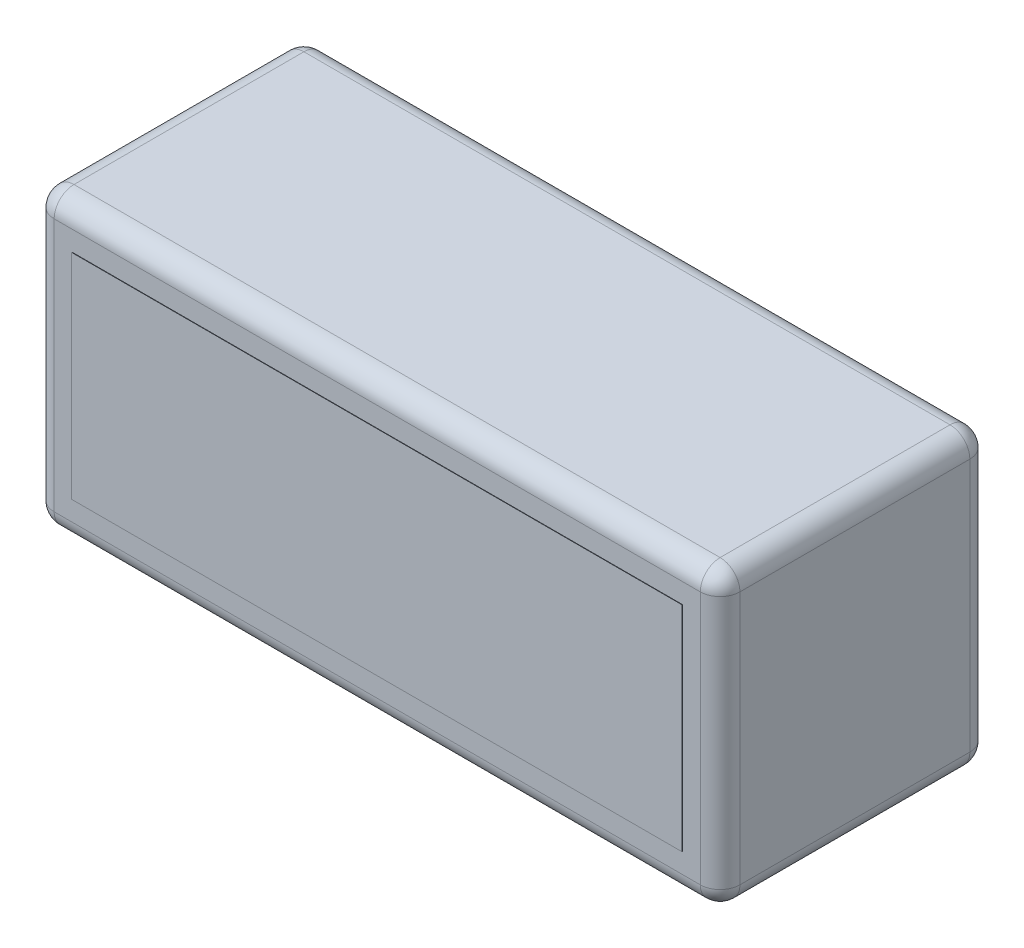
ISO-10303-21;
HEADER;
FILE_DESCRIPTION(('STEP AP214'),'2;1');
FILE_NAME('part.step','',(''),(''),'','','');
FILE_SCHEMA(('AUTOMOTIVE_DESIGN { 1 0 10303 214 1 1 1 1 }'));
ENDSEC;
DATA;
#1=APPLICATION_CONTEXT('core data for automotive mechanical design processes');
#2=APPLICATION_PROTOCOL_DEFINITION('international standard','automotive_design',2000,#1);
#3=PRODUCT_CONTEXT('',#1,'mechanical');
#4=PRODUCT('Part','Part','',(#3));
#5=PRODUCT_RELATED_PRODUCT_CATEGORY('part','',(#4));
#6=PRODUCT_DEFINITION_FORMATION('','',#4);
#7=PRODUCT_DEFINITION_CONTEXT('part definition',#1,'design');
#8=PRODUCT_DEFINITION('design','',#6,#7);
#9=PRODUCT_DEFINITION_SHAPE('','',#8);
#10=(LENGTH_UNIT() NAMED_UNIT(*) SI_UNIT(.MILLI.,.METRE.));
#11=(NAMED_UNIT(*) PLANE_ANGLE_UNIT() SI_UNIT($,.RADIAN.));
#12=(NAMED_UNIT(*) SI_UNIT($,.STERADIAN.) SOLID_ANGLE_UNIT());
#13=UNCERTAINTY_MEASURE_WITH_UNIT(LENGTH_MEASURE(1.E-05),#10,'distance_accuracy_value','');
#14=(GEOMETRIC_REPRESENTATION_CONTEXT(3) GLOBAL_UNCERTAINTY_ASSIGNED_CONTEXT((#13)) GLOBAL_UNIT_ASSIGNED_CONTEXT((#10,
#11,#12)) REPRESENTATION_CONTEXT('',''));
#15=CARTESIAN_POINT('',(0.,0.,0.));
#16=DIRECTION('',(0.,0.,1.));
#17=DIRECTION('',(1.,0.,0.));
#18=AXIS2_PLACEMENT_3D('',#15,#16,#17);
#19=CARTESIAN_POINT('',(86.5,74.,34.));
#20=DIRECTION('',(0.,0.,-1.));
#21=DIRECTION('',(-1.,0.,0.));
#22=AXIS2_PLACEMENT_3D('',#19,#20,#21);
#23=PLANE('',#22);
#24=DIRECTION('',(0.,-1.,0.));
#25=VECTOR('',#24,1.);
#26=CARTESIAN_POINT('',(-81.5,74.,34.));
#27=LINE('',#26,#25);
#28=CARTESIAN_POINT('',(-81.5,69.,34.));
#29=VERTEX_POINT('',#28);
#30=CARTESIAN_POINT('',(-81.5,5.,34.));
#31=VERTEX_POINT('',#30);
#32=EDGE_CURVE('E240',#29,#31,#27,.T.);
#33=ORIENTED_EDGE('',*,*,#32,.T.);
#34=DIRECTION('',(1.,0.,0.));
#35=VECTOR('',#34,1.);
#36=CARTESIAN_POINT('',(86.5,5.,34.));
#37=LINE('',#36,#35);
#38=CARTESIAN_POINT('',(81.5,5.,34.));
#39=VERTEX_POINT('',#38);
#40=EDGE_CURVE('E247',#31,#39,#37,.T.);
#41=ORIENTED_EDGE('',*,*,#40,.T.);
#42=DIRECTION('',(0.,-1.,0.));
#43=VECTOR('',#42,1.);
#44=CARTESIAN_POINT('',(81.5,74.,34.));
#45=LINE('',#44,#43);
#46=CARTESIAN_POINT('',(81.5,69.,34.));
#47=VERTEX_POINT('',#46);
#48=EDGE_CURVE('E243',#39,#47,#45,.F.);
#49=ORIENTED_EDGE('',*,*,#48,.T.);
#50=DIRECTION('',(1.,0.,0.));
#51=VECTOR('',#50,1.);
#52=CARTESIAN_POINT('',(-86.5,69.,34.));
#53=LINE('',#52,#51);
#54=EDGE_CURVE('E237',#47,#29,#53,.F.);
#55=ORIENTED_EDGE('',*,*,#54,.T.);
#56=EDGE_LOOP('',(#33,#41,#49,#55));
#57=FACE_BOUND('',#56,.T.);
#58=DIRECTION('',(0.,-1.,0.));
#59=VECTOR('',#58,1.);
#60=CARTESIAN_POINT('',(-76.9958074128287,10.022768222768,34.));
#61=LINE('',#60,#59);
#62=CARTESIAN_POINT('',(-76.9958074128287,63.977231777232,34.));
#63=VERTEX_POINT('',#62);
#64=CARTESIAN_POINT('',(-76.9958074128287,10.022768222768,34.));
#65=VERTEX_POINT('',#64);
#66=EDGE_CURVE('E210',#63,#65,#61,.T.);
#67=ORIENTED_EDGE('',*,*,#66,.F.);
#68=DIRECTION('',(-1.,0.,0.));
#69=VECTOR('',#68,1.);
#70=CARTESIAN_POINT('',(76.9958074128287,63.977231777232,34.));
#71=LINE('',#70,#69);
#72=CARTESIAN_POINT('',(76.9958074128287,63.977231777232,34.));
#73=VERTEX_POINT('',#72);
#74=EDGE_CURVE('E207',#73,#63,#71,.T.);
#75=ORIENTED_EDGE('',*,*,#74,.F.);
#76=DIRECTION('',(0.,1.,0.));
#77=VECTOR('',#76,1.);
#78=CARTESIAN_POINT('',(76.9958074128287,10.022768222768,34.));
#79=LINE('',#78,#77);
#80=CARTESIAN_POINT('',(76.9958074128287,10.022768222768,34.));
#81=VERTEX_POINT('',#80);
#82=EDGE_CURVE('E69',#81,#73,#79,.T.);
#83=ORIENTED_EDGE('',*,*,#82,.F.);
#84=DIRECTION('',(1.,0.,0.));
#85=VECTOR('',#84,1.);
#86=CARTESIAN_POINT('',(76.9958074128287,10.022768222768,34.));
#87=LINE('',#86,#85);
#88=EDGE_CURVE('E61',#65,#81,#87,.T.);
#89=ORIENTED_EDGE('',*,*,#88,.F.);
#90=EDGE_LOOP('',(#67,#75,#83,#89));
#91=FACE_BOUND('',#90,.T.);
#92=ADVANCED_FACE('F40',(#57,#91),#23,.F.);
#93=CARTESIAN_POINT('',(-86.5,74.,34.));
#94=DIRECTION('',(1.,0.,0.));
#95=DIRECTION('',(0.,0.,-1.));
#96=AXIS2_PLACEMENT_3D('',#93,#94,#95);
#97=PLANE('',#96);
#98=DIRECTION('',(0.,0.,1.));
#99=VECTOR('',#98,1.);
#100=CARTESIAN_POINT('',(-86.5,69.,-34.));
#101=LINE('',#100,#99);
#102=CARTESIAN_POINT('',(-86.5,69.,29.));
#103=VERTEX_POINT('',#102);
#104=CARTESIAN_POINT('',(-86.5,69.,-29.));
#105=VERTEX_POINT('',#104);
#106=EDGE_CURVE('E289',#103,#105,#101,.F.);
#107=ORIENTED_EDGE('',*,*,#106,.T.);
#108=DIRECTION('',(0.,-1.,0.));
#109=VECTOR('',#108,1.);
#110=CARTESIAN_POINT('',(-86.5,74.,-29.));
#111=LINE('',#110,#109);
#112=CARTESIAN_POINT('',(-86.5,5.,-29.));
#113=VERTEX_POINT('',#112);
#114=EDGE_CURVE('E11',#105,#113,#111,.T.);
#115=ORIENTED_EDGE('',*,*,#114,.T.);
#116=DIRECTION('',(0.,0.,1.));
#117=VECTOR('',#116,1.);
#118=CARTESIAN_POINT('',(-86.5,5.,34.));
#119=LINE('',#118,#117);
#120=CARTESIAN_POINT('',(-86.5,5.,29.));
#121=VERTEX_POINT('',#120);
#122=EDGE_CURVE('E50',#113,#121,#119,.T.);
#123=ORIENTED_EDGE('',*,*,#122,.T.);
#124=DIRECTION('',(0.,-1.,0.));
#125=VECTOR('',#124,1.);
#126=CARTESIAN_POINT('',(-86.5,74.,29.));
#127=LINE('',#126,#125);
#128=EDGE_CURVE('E292',#121,#103,#127,.F.);
#129=ORIENTED_EDGE('',*,*,#128,.T.);
#130=EDGE_LOOP('',(#107,#115,#123,#129));
#131=FACE_BOUND('',#130,.T.);
#132=ADVANCED_FACE('F423',(#131),#97,.F.);
#133=CARTESIAN_POINT('',(86.5,74.,34.));
#134=DIRECTION('',(-1.,0.,0.));
#135=DIRECTION('',(0.,0.,1.));
#136=AXIS2_PLACEMENT_3D('',#133,#134,#135);
#137=PLANE('',#136);
#138=DIRECTION('',(0.,0.,-1.));
#139=VECTOR('',#138,1.);
#140=CARTESIAN_POINT('',(86.5,69.,34.));
#141=LINE('',#140,#139);
#142=CARTESIAN_POINT('',(86.5,69.,-29.));
#143=VERTEX_POINT('',#142);
#144=CARTESIAN_POINT('',(86.5,69.,29.));
#145=VERTEX_POINT('',#144);
#146=EDGE_CURVE('E230',#143,#145,#141,.F.);
#147=ORIENTED_EDGE('',*,*,#146,.T.);
#148=DIRECTION('',(0.,-1.,0.));
#149=VECTOR('',#148,1.);
#150=CARTESIAN_POINT('',(86.5,74.,29.));
#151=LINE('',#150,#149);
#152=CARTESIAN_POINT('',(86.5,5.,29.));
#153=VERTEX_POINT('',#152);
#154=EDGE_CURVE('E233',#145,#153,#151,.T.);
#155=ORIENTED_EDGE('',*,*,#154,.T.);
#156=DIRECTION('',(0.,0.,-1.));
#157=VECTOR('',#156,1.);
#158=CARTESIAN_POINT('',(86.5,5.,34.));
#159=LINE('',#158,#157);
#160=CARTESIAN_POINT('',(86.5,5.,-29.));
#161=VERTEX_POINT('',#160);
#162=EDGE_CURVE('E224',#153,#161,#159,.T.);
#163=ORIENTED_EDGE('',*,*,#162,.T.);
#164=DIRECTION('',(0.,-1.,0.));
#165=VECTOR('',#164,1.);
#166=CARTESIAN_POINT('',(86.5,74.,-29.));
#167=LINE('',#166,#165);
#168=EDGE_CURVE('E227',#161,#143,#167,.F.);
#169=ORIENTED_EDGE('',*,*,#168,.T.);
#170=EDGE_LOOP('',(#147,#155,#163,#169));
#171=FACE_BOUND('',#170,.T.);
#172=ADVANCED_FACE('F473',(#171),#137,.F.);
#173=CARTESIAN_POINT('',(86.5,74.,-34.));
#174=DIRECTION('',(0.,0.,1.));
#175=DIRECTION('',(1.,0.,0.));
#176=AXIS2_PLACEMENT_3D('',#173,#174,#175);
#177=PLANE('',#176);
#178=DIRECTION('',(-1.,0.,0.));
#179=VECTOR('',#178,1.);
#180=CARTESIAN_POINT('',(86.5,69.,-34.));
#181=LINE('',#180,#179);
#182=CARTESIAN_POINT('',(-81.5,69.,-34.));
#183=VERTEX_POINT('',#182);
#184=CARTESIAN_POINT('',(81.5,69.,-34.));
#185=VERTEX_POINT('',#184);
#186=EDGE_CURVE('E263',#183,#185,#181,.F.);
#187=ORIENTED_EDGE('',*,*,#186,.T.);
#188=DIRECTION('',(0.,-1.,0.));
#189=VECTOR('',#188,1.);
#190=CARTESIAN_POINT('',(81.5,74.,-34.));
#191=LINE('',#190,#189);
#192=CARTESIAN_POINT('',(81.5,5.,-34.));
#193=VERTEX_POINT('',#192);
#194=EDGE_CURVE('E272',#185,#193,#191,.T.);
#195=ORIENTED_EDGE('',*,*,#194,.T.);
#196=DIRECTION('',(-1.,0.,0.));
#197=VECTOR('',#196,1.);
#198=CARTESIAN_POINT('',(86.5,5.,-34.));
#199=LINE('',#198,#197);
#200=CARTESIAN_POINT('',(-81.5,5.,-34.));
#201=VERTEX_POINT('',#200);
#202=EDGE_CURVE('E269',#193,#201,#199,.T.);
#203=ORIENTED_EDGE('',*,*,#202,.T.);
#204=DIRECTION('',(0.,-1.,0.));
#205=VECTOR('',#204,1.);
#206=CARTESIAN_POINT('',(-81.5,74.,-34.));
#207=LINE('',#206,#205);
#208=EDGE_CURVE('E266',#201,#183,#207,.F.);
#209=ORIENTED_EDGE('',*,*,#208,.T.);
#210=EDGE_LOOP('',(#187,#195,#203,#209));
#211=FACE_BOUND('',#210,.T.);
#212=ADVANCED_FACE('F408',(#211),#177,.F.);
#213=CARTESIAN_POINT('',(0.,74.,0.));
#214=DIRECTION('',(0.,1.,0.));
#215=DIRECTION('',(0.,0.,1.));
#216=AXIS2_PLACEMENT_3D('',#213,#214,#215);
#217=PLANE('',#216);
#218=DIRECTION('',(1.,0.,0.));
#219=VECTOR('',#218,1.);
#220=CARTESIAN_POINT('',(86.5,74.,29.));
#221=LINE('',#220,#219);
#222=CARTESIAN_POINT('',(-81.5,74.,29.));
#223=VERTEX_POINT('',#222);
#224=CARTESIAN_POINT('',(81.5,74.,29.));
#225=VERTEX_POINT('',#224);
#226=EDGE_CURVE('E250',#223,#225,#221,.T.);
#227=ORIENTED_EDGE('',*,*,#226,.T.);
#228=DIRECTION('',(0.,0.,-1.));
#229=VECTOR('',#228,1.);
#230=CARTESIAN_POINT('',(81.5,74.,-34.));
#231=LINE('',#230,#229);
#232=CARTESIAN_POINT('',(81.5,74.,-29.));
#233=VERTEX_POINT('',#232);
#234=EDGE_CURVE('E259',#225,#233,#231,.T.);
#235=ORIENTED_EDGE('',*,*,#234,.T.);
#236=DIRECTION('',(-1.,0.,0.));
#237=VECTOR('',#236,1.);
#238=CARTESIAN_POINT('',(-86.5,74.,-29.));
#239=LINE('',#238,#237);
#240=CARTESIAN_POINT('',(-81.5,74.,-29.));
#241=VERTEX_POINT('',#240);
#242=EDGE_CURVE('E256',#233,#241,#239,.T.);
#243=ORIENTED_EDGE('',*,*,#242,.T.);
#244=DIRECTION('',(0.,0.,1.));
#245=VECTOR('',#244,1.);
#246=CARTESIAN_POINT('',(-81.5,74.,34.));
#247=LINE('',#246,#245);
#248=EDGE_CURVE('E253',#241,#223,#247,.T.);
#249=ORIENTED_EDGE('',*,*,#248,.T.);
#250=EDGE_LOOP('',(#227,#235,#243,#249));
#251=FACE_BOUND('',#250,.T.);
#252=ADVANCED_FACE('F399',(#251),#217,.T.);
#253=CARTESIAN_POINT('',(0.,0.,0.));
#254=DIRECTION('',(0.,1.,0.));
#255=DIRECTION('',(0.,0.,1.));
#256=AXIS2_PLACEMENT_3D('',#253,#254,#255);
#257=PLANE('',#256);
#258=DIRECTION('',(-1.,0.,0.));
#259=VECTOR('',#258,1.);
#260=CARTESIAN_POINT('',(0.,0.,-29.));
#261=LINE('',#260,#259);
#262=CARTESIAN_POINT('',(-81.5,0.,-29.));
#263=VERTEX_POINT('',#262);
#264=CARTESIAN_POINT('',(81.5,0.,-29.));
#265=VERTEX_POINT('',#264);
#266=EDGE_CURVE('E282',#263,#265,#261,.F.);
#267=ORIENTED_EDGE('',*,*,#266,.T.);
#268=DIRECTION('',(0.,0.,-1.));
#269=VECTOR('',#268,1.);
#270=CARTESIAN_POINT('',(81.5,0.,0.));
#271=LINE('',#270,#269);
#272=CARTESIAN_POINT('',(81.5,0.,29.));
#273=VERTEX_POINT('',#272);
#274=EDGE_CURVE('E285',#265,#273,#271,.F.);
#275=ORIENTED_EDGE('',*,*,#274,.T.);
#276=DIRECTION('',(1.,0.,0.));
#277=VECTOR('',#276,1.);
#278=CARTESIAN_POINT('',(0.,0.,29.));
#279=LINE('',#278,#277);
#280=CARTESIAN_POINT('',(-81.5,0.,29.));
#281=VERTEX_POINT('',#280);
#282=EDGE_CURVE('E276',#273,#281,#279,.F.);
#283=ORIENTED_EDGE('',*,*,#282,.T.);
#284=DIRECTION('',(0.,0.,1.));
#285=VECTOR('',#284,1.);
#286=CARTESIAN_POINT('',(-81.5,0.,0.));
#287=LINE('',#286,#285);
#288=EDGE_CURVE('E279',#281,#263,#287,.F.);
#289=ORIENTED_EDGE('',*,*,#288,.T.);
#290=EDGE_LOOP('',(#267,#275,#283,#289));
#291=FACE_BOUND('',#290,.T.);
#292=ADVANCED_FACE('F573',(#291),#257,.F.);
#293=CARTESIAN_POINT('',(-81.5,74.,-29.));
#294=DIRECTION('',(0.,-1.,0.));
#295=DIRECTION('',(0.,0.,-1.));
#296=AXIS2_PLACEMENT_3D('',#293,#294,#295);
#297=CYLINDRICAL_SURFACE('',#296,5.);
#298=CARTESIAN_POINT('',(-81.5,69.,-29.));
#299=DIRECTION('',(0.,1.,0.));
#300=DIRECTION('',(0.,0.,1.));
#301=AXIS2_PLACEMENT_3D('',#298,#299,#300);
#302=CIRCLE('',#301,5.);
#303=EDGE_CURVE('E44',#183,#105,#302,.T.);
#304=ORIENTED_EDGE('',*,*,#303,.F.);
#305=ORIENTED_EDGE('',*,*,#208,.F.);
#306=CARTESIAN_POINT('',(-81.5,5.,-29.));
#307=DIRECTION('',(0.,-1.,0.));
#308=DIRECTION('',(0.,0.,-1.));
#309=AXIS2_PLACEMENT_3D('',#306,#307,#308);
#310=CIRCLE('',#309,5.);
#311=EDGE_CURVE('E373',#113,#201,#310,.T.);
#312=ORIENTED_EDGE('',*,*,#311,.F.);
#313=ORIENTED_EDGE('',*,*,#114,.F.);
#314=EDGE_LOOP('',(#304,#305,#312,#313));
#315=FACE_BOUND('',#314,.T.);
#316=ADVANCED_FACE('F42',(#315),#297,.T.);
#317=CARTESIAN_POINT('',(-81.5,69.,-29.));
#318=DIRECTION('',(0.,0.,1.));
#319=DIRECTION('',(1.,0.,0.));
#320=AXIS2_PLACEMENT_3D('',#317,#318,#319);
#321=SPHERICAL_SURFACE('',#320,5.);
#322=CARTESIAN_POINT('',(-81.5,69.,-29.));
#323=DIRECTION('',(-1.,0.,0.));
#324=DIRECTION('',(0.,0.,1.));
#325=AXIS2_PLACEMENT_3D('',#322,#323,#324);
#326=CIRCLE('',#325,5.);
#327=EDGE_CURVE('E366',#183,#241,#326,.F.);
#328=ORIENTED_EDGE('',*,*,#327,.F.);
#329=ORIENTED_EDGE('',*,*,#303,.T.);
#330=CARTESIAN_POINT('',(-81.5,69.,-29.));
#331=DIRECTION('',(0.,0.,-1.));
#332=DIRECTION('',(0.,1.,0.));
#333=AXIS2_PLACEMENT_3D('',#330,#331,#332);
#334=CIRCLE('',#333,5.);
#335=EDGE_CURVE('E370',#241,#105,#334,.F.);
#336=ORIENTED_EDGE('',*,*,#335,.F.);
#337=EDGE_LOOP('',(#328,#329,#336));
#338=FACE_BOUND('',#337,.T.);
#339=ADVANCED_FACE('F386',(#338),#321,.T.);
#340=CARTESIAN_POINT('',(-81.5,5.,-29.));
#341=DIRECTION('',(0.,0.,1.));
#342=DIRECTION('',(1.,0.,0.));
#343=AXIS2_PLACEMENT_3D('',#340,#341,#342);
#344=SPHERICAL_SURFACE('',#343,5.);
#345=CARTESIAN_POINT('',(-81.5,5.,-29.));
#346=DIRECTION('',(0.,0.,-1.));
#347=DIRECTION('',(-1.,0.,0.));
#348=AXIS2_PLACEMENT_3D('',#345,#346,#347);
#349=CIRCLE('',#348,5.);
#350=EDGE_CURVE('E358',#113,#263,#349,.F.);
#351=ORIENTED_EDGE('',*,*,#350,.F.);
#352=ORIENTED_EDGE('',*,*,#311,.T.);
#353=CARTESIAN_POINT('',(-81.5,5.,-29.));
#354=DIRECTION('',(-1.,0.,0.));
#355=DIRECTION('',(0.,0.,1.));
#356=AXIS2_PLACEMENT_3D('',#353,#354,#355);
#357=CIRCLE('',#356,5.);
#358=EDGE_CURVE('E362',#263,#201,#357,.F.);
#359=ORIENTED_EDGE('',*,*,#358,.F.);
#360=EDGE_LOOP('',(#351,#352,#359));
#361=FACE_BOUND('',#360,.T.);
#362=ADVANCED_FACE('F697',(#361),#344,.T.);
#363=CARTESIAN_POINT('',(-81.5,69.,0.));
#364=DIRECTION('',(0.,0.,-1.));
#365=DIRECTION('',(-1.,0.,0.));
#366=AXIS2_PLACEMENT_3D('',#363,#364,#365);
#367=CYLINDRICAL_SURFACE('',#366,5.);
#368=ORIENTED_EDGE('',*,*,#335,.T.);
#369=ORIENTED_EDGE('',*,*,#106,.F.);
#370=CARTESIAN_POINT('',(-81.5,69.,29.));
#371=DIRECTION('',(0.,0.,1.));
#372=DIRECTION('',(1.,0.,0.));
#373=AXIS2_PLACEMENT_3D('',#370,#371,#372);
#374=CIRCLE('',#373,5.);
#375=EDGE_CURVE('E350',#223,#103,#374,.T.);
#376=ORIENTED_EDGE('',*,*,#375,.F.);
#377=ORIENTED_EDGE('',*,*,#248,.F.);
#378=EDGE_LOOP('',(#368,#369,#376,#377));
#379=FACE_BOUND('',#378,.T.);
#380=ADVANCED_FACE('F394',(#379),#367,.T.);
#381=CARTESIAN_POINT('',(0.,69.,-29.));
#382=DIRECTION('',(1.,0.,0.));
#383=DIRECTION('',(0.,0.,-1.));
#384=AXIS2_PLACEMENT_3D('',#381,#382,#383);
#385=CYLINDRICAL_SURFACE('',#384,5.);
#386=ORIENTED_EDGE('',*,*,#327,.T.);
#387=ORIENTED_EDGE('',*,*,#242,.F.);
#388=CARTESIAN_POINT('',(81.5,69.,-29.));
#389=DIRECTION('',(1.,0.,0.));
#390=DIRECTION('',(0.,0.,-1.));
#391=AXIS2_PLACEMENT_3D('',#388,#389,#390);
#392=CIRCLE('',#391,5.);
#393=EDGE_CURVE('E346',#185,#233,#392,.T.);
#394=ORIENTED_EDGE('',*,*,#393,.F.);
#395=ORIENTED_EDGE('',*,*,#186,.F.);
#396=EDGE_LOOP('',(#386,#387,#394,#395));
#397=FACE_BOUND('',#396,.T.);
#398=ADVANCED_FACE('F405',(#397),#385,.T.);
#399=CARTESIAN_POINT('',(81.5,74.,-29.));
#400=DIRECTION('',(0.,-1.,0.));
#401=DIRECTION('',(0.,0.,-1.));
#402=AXIS2_PLACEMENT_3D('',#399,#400,#401);
#403=CYLINDRICAL_SURFACE('',#402,5.);
#404=CARTESIAN_POINT('',(81.5,5.,-29.));
#405=DIRECTION('',(0.,-1.,0.));
#406=DIRECTION('',(0.,0.,-1.));
#407=AXIS2_PLACEMENT_3D('',#404,#405,#406);
#408=CIRCLE('',#407,5.);
#409=EDGE_CURVE('E338',#193,#161,#408,.T.);
#410=ORIENTED_EDGE('',*,*,#409,.F.);
#411=ORIENTED_EDGE('',*,*,#194,.F.);
#412=CARTESIAN_POINT('',(81.5,69.,-29.));
#413=DIRECTION('',(0.,1.,0.));
#414=DIRECTION('',(0.,0.,1.));
#415=AXIS2_PLACEMENT_3D('',#412,#413,#414);
#416=CIRCLE('',#415,5.);
#417=EDGE_CURVE('E342',#143,#185,#416,.T.);
#418=ORIENTED_EDGE('',*,*,#417,.F.);
#419=ORIENTED_EDGE('',*,*,#168,.F.);
#420=EDGE_LOOP('',(#410,#411,#418,#419));
#421=FACE_BOUND('',#420,.T.);
#422=ADVANCED_FACE('F412',(#421),#403,.T.);
#423=CARTESIAN_POINT('',(86.5,5.,-29.));
#424=DIRECTION('',(-1.,0.,0.));
#425=DIRECTION('',(0.,0.,1.));
#426=AXIS2_PLACEMENT_3D('',#423,#424,#425);
#427=CYLINDRICAL_SURFACE('',#426,5.);
#428=ORIENTED_EDGE('',*,*,#358,.T.);
#429=ORIENTED_EDGE('',*,*,#202,.F.);
#430=CARTESIAN_POINT('',(81.5,5.,-29.));
#431=DIRECTION('',(1.,0.,0.));
#432=DIRECTION('',(0.,0.,-1.));
#433=AXIS2_PLACEMENT_3D('',#430,#431,#432);
#434=CIRCLE('',#433,5.);
#435=EDGE_CURVE('E335',#265,#193,#434,.T.);
#436=ORIENTED_EDGE('',*,*,#435,.F.);
#437=ORIENTED_EDGE('',*,*,#266,.F.);
#438=EDGE_LOOP('',(#428,#429,#436,#437));
#439=FACE_BOUND('',#438,.T.);
#440=ADVANCED_FACE('F420',(#439),#427,.T.);
#441=CARTESIAN_POINT('',(-81.5,5.,34.));
#442=DIRECTION('',(0.,0.,1.));
#443=DIRECTION('',(1.,0.,0.));
#444=AXIS2_PLACEMENT_3D('',#441,#442,#443);
#445=CYLINDRICAL_SURFACE('',#444,5.);
#446=ORIENTED_EDGE('',*,*,#350,.T.);
#447=ORIENTED_EDGE('',*,*,#288,.F.);
#448=CARTESIAN_POINT('',(-81.5,5.,29.));
#449=DIRECTION('',(0.,0.,1.));
#450=DIRECTION('',(1.,0.,0.));
#451=AXIS2_PLACEMENT_3D('',#448,#449,#450);
#452=CIRCLE('',#451,5.);
#453=EDGE_CURVE('E332',#121,#281,#452,.T.);
#454=ORIENTED_EDGE('',*,*,#453,.F.);
#455=ORIENTED_EDGE('',*,*,#122,.F.);
#456=EDGE_LOOP('',(#446,#447,#454,#455));
#457=FACE_BOUND('',#456,.T.);
#458=ADVANCED_FACE('F433',(#457),#445,.T.);
#459=CARTESIAN_POINT('',(-81.5,74.,29.));
#460=DIRECTION('',(0.,-1.,0.));
#461=DIRECTION('',(0.,0.,-1.));
#462=AXIS2_PLACEMENT_3D('',#459,#460,#461);
#463=CYLINDRICAL_SURFACE('',#462,5.);
#464=CARTESIAN_POINT('',(-81.5,69.,29.));
#465=DIRECTION('',(0.,1.,0.));
#466=DIRECTION('',(0.,0.,1.));
#467=AXIS2_PLACEMENT_3D('',#464,#465,#466);
#468=CIRCLE('',#467,5.);
#469=EDGE_CURVE('E354',#103,#29,#468,.T.);
#470=ORIENTED_EDGE('',*,*,#469,.F.);
#471=ORIENTED_EDGE('',*,*,#128,.F.);
#472=CARTESIAN_POINT('',(-81.5,5.,29.));
#473=DIRECTION('',(0.,-1.,0.));
#474=DIRECTION('',(0.,0.,-1.));
#475=AXIS2_PLACEMENT_3D('',#472,#473,#474);
#476=CIRCLE('',#475,5.);
#477=EDGE_CURVE('E329',#31,#121,#476,.T.);
#478=ORIENTED_EDGE('',*,*,#477,.F.);
#479=ORIENTED_EDGE('',*,*,#32,.F.);
#480=EDGE_LOOP('',(#470,#471,#478,#479));
#481=FACE_BOUND('',#480,.T.);
#482=ADVANCED_FACE('F428',(#481),#463,.T.);
#483=CARTESIAN_POINT('',(-81.5,69.,29.));
#484=DIRECTION('',(0.,0.,1.));
#485=DIRECTION('',(1.,0.,0.));
#486=AXIS2_PLACEMENT_3D('',#483,#484,#485);
#487=SPHERICAL_SURFACE('',#486,5.);
#488=ORIENTED_EDGE('',*,*,#375,.T.);
#489=ORIENTED_EDGE('',*,*,#469,.T.);
#490=CARTESIAN_POINT('',(-81.5,69.,29.));
#491=DIRECTION('',(-1.,0.,0.));
#492=DIRECTION('',(0.,0.,1.));
#493=AXIS2_PLACEMENT_3D('',#490,#491,#492);
#494=CIRCLE('',#493,5.);
#495=EDGE_CURVE('E325',#223,#29,#494,.F.);
#496=ORIENTED_EDGE('',*,*,#495,.F.);
#497=EDGE_LOOP('',(#488,#489,#496));
#498=FACE_BOUND('',#497,.T.);
#499=ADVANCED_FACE('F445',(#498),#487,.T.);
#500=CARTESIAN_POINT('',(81.5,69.,-29.));
#501=DIRECTION('',(0.,0.,1.));
#502=DIRECTION('',(1.,0.,0.));
#503=AXIS2_PLACEMENT_3D('',#500,#501,#502);
#504=SPHERICAL_SURFACE('',#503,5.);
#505=ORIENTED_EDGE('',*,*,#417,.T.);
#506=ORIENTED_EDGE('',*,*,#393,.T.);
#507=CARTESIAN_POINT('',(81.5,69.,-29.));
#508=DIRECTION('',(0.,0.,-1.));
#509=DIRECTION('',(-1.,0.,0.));
#510=AXIS2_PLACEMENT_3D('',#507,#508,#509);
#511=CIRCLE('',#510,5.);
#512=EDGE_CURVE('E322',#143,#233,#511,.F.);
#513=ORIENTED_EDGE('',*,*,#512,.F.);
#514=EDGE_LOOP('',(#505,#506,#513));
#515=FACE_BOUND('',#514,.T.);
#516=ADVANCED_FACE('F458',(#515),#504,.T.);
#517=CARTESIAN_POINT('',(81.5,5.,-29.));
#518=DIRECTION('',(0.,0.,1.));
#519=DIRECTION('',(1.,0.,0.));
#520=AXIS2_PLACEMENT_3D('',#517,#518,#519);
#521=SPHERICAL_SURFACE('',#520,5.);
#522=ORIENTED_EDGE('',*,*,#435,.T.);
#523=ORIENTED_EDGE('',*,*,#409,.T.);
#524=CARTESIAN_POINT('',(81.5,5.,-29.));
#525=DIRECTION('',(0.,0.,-1.));
#526=DIRECTION('',(-1.,0.,0.));
#527=AXIS2_PLACEMENT_3D('',#524,#525,#526);
#528=CIRCLE('',#527,5.);
#529=EDGE_CURVE('E318',#265,#161,#528,.F.);
#530=ORIENTED_EDGE('',*,*,#529,.F.);
#531=EDGE_LOOP('',(#522,#523,#530));
#532=FACE_BOUND('',#531,.T.);
#533=ADVANCED_FACE('F460',(#532),#521,.T.);
#534=CARTESIAN_POINT('',(-81.5,5.,29.));
#535=DIRECTION('',(0.,0.,1.));
#536=DIRECTION('',(1.,0.,0.));
#537=AXIS2_PLACEMENT_3D('',#534,#535,#536);
#538=SPHERICAL_SURFACE('',#537,5.);
#539=ORIENTED_EDGE('',*,*,#477,.T.);
#540=ORIENTED_EDGE('',*,*,#453,.T.);
#541=CARTESIAN_POINT('',(-81.5,5.,29.));
#542=DIRECTION('',(-1.,0.,0.));
#543=DIRECTION('',(0.,0.,1.));
#544=AXIS2_PLACEMENT_3D('',#541,#542,#543);
#545=CIRCLE('',#544,5.);
#546=EDGE_CURVE('E314',#31,#281,#545,.F.);
#547=ORIENTED_EDGE('',*,*,#546,.F.);
#548=EDGE_LOOP('',(#539,#540,#547));
#549=FACE_BOUND('',#548,.T.);
#550=ADVANCED_FACE('F435',(#549),#538,.T.);
#551=CARTESIAN_POINT('',(0.,69.,29.));
#552=DIRECTION('',(-1.,0.,0.));
#553=DIRECTION('',(0.,0.,1.));
#554=AXIS2_PLACEMENT_3D('',#551,#552,#553);
#555=CYLINDRICAL_SURFACE('',#554,5.);
#556=ORIENTED_EDGE('',*,*,#495,.T.);
#557=ORIENTED_EDGE('',*,*,#54,.F.);
#558=CARTESIAN_POINT('',(81.5,69.,29.));
#559=DIRECTION('',(1.,0.,0.));
#560=DIRECTION('',(0.,0.,-1.));
#561=AXIS2_PLACEMENT_3D('',#558,#559,#560);
#562=CIRCLE('',#561,5.);
#563=EDGE_CURVE('E310',#225,#47,#562,.T.);
#564=ORIENTED_EDGE('',*,*,#563,.F.);
#565=ORIENTED_EDGE('',*,*,#226,.F.);
#566=EDGE_LOOP('',(#556,#557,#564,#565));
#567=FACE_BOUND('',#566,.T.);
#568=ADVANCED_FACE('F447',(#567),#555,.T.);
#569=CARTESIAN_POINT('',(81.5,69.,0.));
#570=DIRECTION('',(0.,0.,1.));
#571=DIRECTION('',(1.,0.,0.));
#572=AXIS2_PLACEMENT_3D('',#569,#570,#571);
#573=CYLINDRICAL_SURFACE('',#572,5.);
#574=ORIENTED_EDGE('',*,*,#512,.T.);
#575=ORIENTED_EDGE('',*,*,#234,.F.);
#576=CARTESIAN_POINT('',(81.5,69.,29.));
#577=DIRECTION('',(0.,0.,1.));
#578=DIRECTION('',(1.,0.,0.));
#579=AXIS2_PLACEMENT_3D('',#576,#577,#578);
#580=CIRCLE('',#579,5.);
#581=EDGE_CURVE('E306',#145,#225,#580,.T.);
#582=ORIENTED_EDGE('',*,*,#581,.F.);
#583=ORIENTED_EDGE('',*,*,#146,.F.);
#584=EDGE_LOOP('',(#574,#575,#582,#583));
#585=FACE_BOUND('',#584,.T.);
#586=ADVANCED_FACE('F456',(#585),#573,.T.);
#587=CARTESIAN_POINT('',(81.5,5.,34.));
#588=DIRECTION('',(0.,0.,-1.));
#589=DIRECTION('',(-1.,0.,0.));
#590=AXIS2_PLACEMENT_3D('',#587,#588,#589);
#591=CYLINDRICAL_SURFACE('',#590,5.);
#592=ORIENTED_EDGE('',*,*,#529,.T.);
#593=ORIENTED_EDGE('',*,*,#162,.F.);
#594=CARTESIAN_POINT('',(81.5,5.,29.));
#595=DIRECTION('',(0.,0.,1.));
#596=DIRECTION('',(1.,0.,0.));
#597=AXIS2_PLACEMENT_3D('',#594,#595,#596);
#598=CIRCLE('',#597,5.);
#599=EDGE_CURVE('E302',#273,#153,#598,.T.);
#600=ORIENTED_EDGE('',*,*,#599,.F.);
#601=ORIENTED_EDGE('',*,*,#274,.F.);
#602=EDGE_LOOP('',(#592,#593,#600,#601));
#603=FACE_BOUND('',#602,.T.);
#604=ADVANCED_FACE('F490',(#603),#591,.T.);
#605=CARTESIAN_POINT('',(86.5,5.,29.));
#606=DIRECTION('',(1.,0.,0.));
#607=DIRECTION('',(0.,0.,-1.));
#608=AXIS2_PLACEMENT_3D('',#605,#606,#607);
#609=CYLINDRICAL_SURFACE('',#608,5.);
#610=ORIENTED_EDGE('',*,*,#546,.T.);
#611=ORIENTED_EDGE('',*,*,#282,.F.);
#612=CARTESIAN_POINT('',(81.5,5.,29.));
#613=DIRECTION('',(1.,0.,0.));
#614=DIRECTION('',(0.,0.,-1.));
#615=AXIS2_PLACEMENT_3D('',#612,#613,#614);
#616=CIRCLE('',#615,5.);
#617=EDGE_CURVE('E299',#39,#273,#616,.T.);
#618=ORIENTED_EDGE('',*,*,#617,.F.);
#619=ORIENTED_EDGE('',*,*,#40,.F.);
#620=EDGE_LOOP('',(#610,#611,#618,#619));
#621=FACE_BOUND('',#620,.T.);
#622=ADVANCED_FACE('F440',(#621),#609,.T.);
#623=CARTESIAN_POINT('',(81.5,69.,29.));
#624=DIRECTION('',(0.,0.,1.));
#625=DIRECTION('',(1.,0.,0.));
#626=AXIS2_PLACEMENT_3D('',#623,#624,#625);
#627=SPHERICAL_SURFACE('',#626,5.);
#628=ORIENTED_EDGE('',*,*,#581,.T.);
#629=ORIENTED_EDGE('',*,*,#563,.T.);
#630=CARTESIAN_POINT('',(81.5,69.,29.));
#631=DIRECTION('',(0.,1.,0.));
#632=DIRECTION('',(0.,0.,1.));
#633=AXIS2_PLACEMENT_3D('',#630,#631,#632);
#634=CIRCLE('',#633,5.);
#635=EDGE_CURVE('E217',#145,#47,#634,.F.);
#636=ORIENTED_EDGE('',*,*,#635,.F.);
#637=EDGE_LOOP('',(#628,#629,#636));
#638=FACE_BOUND('',#637,.T.);
#639=ADVANCED_FACE('F452',(#638),#627,.T.);
#640=CARTESIAN_POINT('',(81.5,5.,29.));
#641=DIRECTION('',(0.,0.,1.));
#642=DIRECTION('',(1.,0.,0.));
#643=AXIS2_PLACEMENT_3D('',#640,#641,#642);
#644=SPHERICAL_SURFACE('',#643,5.);
#645=ORIENTED_EDGE('',*,*,#617,.T.);
#646=ORIENTED_EDGE('',*,*,#599,.T.);
#647=CARTESIAN_POINT('',(81.5,5.,29.));
#648=DIRECTION('',(0.,-1.,0.));
#649=DIRECTION('',(0.,0.,-1.));
#650=AXIS2_PLACEMENT_3D('',#647,#648,#649);
#651=CIRCLE('',#650,5.);
#652=EDGE_CURVE('E212',#39,#153,#651,.F.);
#653=ORIENTED_EDGE('',*,*,#652,.F.);
#654=EDGE_LOOP('',(#645,#646,#653));
#655=FACE_BOUND('',#654,.T.);
#656=ADVANCED_FACE('F481',(#655),#644,.T.);
#657=CARTESIAN_POINT('',(81.5,74.,29.));
#658=DIRECTION('',(0.,-1.,0.));
#659=DIRECTION('',(0.,0.,-1.));
#660=AXIS2_PLACEMENT_3D('',#657,#658,#659);
#661=CYLINDRICAL_SURFACE('',#660,5.);
#662=ORIENTED_EDGE('',*,*,#635,.T.);
#663=ORIENTED_EDGE('',*,*,#48,.F.);
#664=ORIENTED_EDGE('',*,*,#652,.T.);
#665=ORIENTED_EDGE('',*,*,#154,.F.);
#666=EDGE_LOOP('',(#662,#663,#664,#665));
#667=FACE_BOUND('',#666,.T.);
#668=ADVANCED_FACE('F478',(#667),#661,.T.);
#669=CARTESIAN_POINT('',(-76.9958074128287,10.022768222768,34.1));
#670=DIRECTION('',(1.,0.,0.));
#671=DIRECTION('',(0.,0.,-1.));
#672=AXIS2_PLACEMENT_3D('',#669,#670,#671);
#673=PLANE('',#672);
#674=ORIENTED_EDGE('',*,*,#66,.T.);
#675=DIRECTION('',(0.,0.,-1.));
#676=VECTOR('',#675,1.);
#677=CARTESIAN_POINT('',(-76.9958074128287,10.022768222768,34.1));
#678=LINE('',#677,#676);
#679=CARTESIAN_POINT('',(-76.9958074128287,10.022768222768,34.1));
#680=VERTEX_POINT('',#679);
#681=EDGE_CURVE('E189',#680,#65,#678,.T.);
#682=ORIENTED_EDGE('',*,*,#681,.F.);
#683=DIRECTION('',(0.,-1.,0.));
#684=VECTOR('',#683,1.);
#685=CARTESIAN_POINT('',(-76.9958074128287,10.022768222768,34.1));
#686=LINE('',#685,#684);
#687=CARTESIAN_POINT('',(-76.9958074128287,63.977231777232,34.1));
#688=VERTEX_POINT('',#687);
#689=EDGE_CURVE('E197',#688,#680,#686,.T.);
#690=ORIENTED_EDGE('',*,*,#689,.F.);
#691=DIRECTION('',(0.,0.,-1.));
#692=VECTOR('',#691,1.);
#693=CARTESIAN_POINT('',(-76.9958074128287,63.977231777232,34.1));
#694=LINE('',#693,#692);
#695=EDGE_CURVE('E741',#688,#63,#694,.T.);
#696=ORIENTED_EDGE('',*,*,#695,.T.);
#697=EDGE_LOOP('',(#674,#682,#690,#696));
#698=FACE_BOUND('',#697,.T.);
#699=ADVANCED_FACE('F209',(#698),#673,.F.);
#700=CARTESIAN_POINT('',(76.9958074128287,10.022768222768,34.1));
#701=DIRECTION('',(0.,1.,0.));
#702=DIRECTION('',(0.,0.,1.));
#703=AXIS2_PLACEMENT_3D('',#700,#701,#702);
#704=PLANE('',#703);
#705=ORIENTED_EDGE('',*,*,#88,.T.);
#706=DIRECTION('',(0.,0.,-1.));
#707=VECTOR('',#706,1.);
#708=CARTESIAN_POINT('',(76.9958074128287,10.022768222768,34.1));
#709=LINE('',#708,#707);
#710=CARTESIAN_POINT('',(76.9958074128287,10.022768222768,34.1));
#711=VERTEX_POINT('',#710);
#712=EDGE_CURVE('E192',#711,#81,#709,.T.);
#713=ORIENTED_EDGE('',*,*,#712,.F.);
#714=DIRECTION('',(1.,0.,0.));
#715=VECTOR('',#714,1.);
#716=CARTESIAN_POINT('',(76.9958074128287,10.022768222768,34.1));
#717=LINE('',#716,#715);
#718=EDGE_CURVE('E185',#680,#711,#717,.T.);
#719=ORIENTED_EDGE('',*,*,#718,.F.);
#720=ORIENTED_EDGE('',*,*,#681,.T.);
#721=EDGE_LOOP('',(#705,#713,#719,#720));
#722=FACE_BOUND('',#721,.T.);
#723=ADVANCED_FACE('F187',(#722),#704,.F.);
#724=CARTESIAN_POINT('',(76.9958074128287,10.022768222768,34.1));
#725=DIRECTION('',(-1.,0.,0.));
#726=DIRECTION('',(0.,0.,1.));
#727=AXIS2_PLACEMENT_3D('',#724,#725,#726);
#728=PLANE('',#727);
#729=ORIENTED_EDGE('',*,*,#82,.T.);
#730=DIRECTION('',(0.,0.,-1.));
#731=VECTOR('',#730,1.);
#732=CARTESIAN_POINT('',(76.9958074128287,63.977231777232,34.1));
#733=LINE('',#732,#731);
#734=CARTESIAN_POINT('',(76.9958074128287,63.977231777232,34.1));
#735=VERTEX_POINT('',#734);
#736=EDGE_CURVE('E220',#735,#73,#733,.T.);
#737=ORIENTED_EDGE('',*,*,#736,.F.);
#738=DIRECTION('',(0.,1.,0.));
#739=VECTOR('',#738,1.);
#740=CARTESIAN_POINT('',(76.9958074128287,10.022768222768,34.1));
#741=LINE('',#740,#739);
#742=EDGE_CURVE('E196',#711,#735,#741,.T.);
#743=ORIENTED_EDGE('',*,*,#742,.F.);
#744=ORIENTED_EDGE('',*,*,#712,.T.);
#745=EDGE_LOOP('',(#729,#737,#743,#744));
#746=FACE_BOUND('',#745,.T.);
#747=ADVANCED_FACE('F546',(#746),#728,.F.);
#748=CARTESIAN_POINT('',(76.9958074128287,63.977231777232,34.1));
#749=DIRECTION('',(0.,-1.,0.));
#750=DIRECTION('',(0.,0.,-1.));
#751=AXIS2_PLACEMENT_3D('',#748,#749,#750);
#752=PLANE('',#751);
#753=ORIENTED_EDGE('',*,*,#74,.T.);
#754=ORIENTED_EDGE('',*,*,#695,.F.);
#755=DIRECTION('',(-1.,0.,0.));
#756=VECTOR('',#755,1.);
#757=CARTESIAN_POINT('',(76.9958074128287,63.977231777232,34.1));
#758=LINE('',#757,#756);
#759=EDGE_CURVE('E202',#735,#688,#758,.T.);
#760=ORIENTED_EDGE('',*,*,#759,.F.);
#761=ORIENTED_EDGE('',*,*,#736,.T.);
#762=EDGE_LOOP('',(#753,#754,#760,#761));
#763=FACE_BOUND('',#762,.T.);
#764=ADVANCED_FACE('F553',(#763),#752,.F.);
#765=CARTESIAN_POINT('',(0.,0.,34.1));
#766=DIRECTION('',(0.,0.,1.));
#767=DIRECTION('',(1.,0.,0.));
#768=AXIS2_PLACEMENT_3D('',#765,#766,#767);
#769=PLANE('',#768);
#770=ORIENTED_EDGE('',*,*,#689,.T.);
#771=ORIENTED_EDGE('',*,*,#718,.T.);
#772=ORIENTED_EDGE('',*,*,#742,.T.);
#773=ORIENTED_EDGE('',*,*,#759,.T.);
#774=EDGE_LOOP('',(#770,#771,#772,#773));
#775=FACE_BOUND('',#774,.T.);
#776=ADVANCED_FACE('F200',(#775),#769,.T.);
#777=CLOSED_SHELL('',(#92,#132,#172,#212,#252,#292,#316,#339,#362,#380,#398,#422,#440,#458,#482,
#499,#516,#533,#550,#568,#586,#604,#622,#639,#656,#668,#699,#723,#747,#764,#776));
#778=MANIFOLD_SOLID_BREP('B2',#777);
#779=ADVANCED_BREP_SHAPE_REPRESENTATION('',(#18,#778),#14);
#780=SHAPE_DEFINITION_REPRESENTATION(#9,#779);
ENDSEC;
END-ISO-10303-21;
